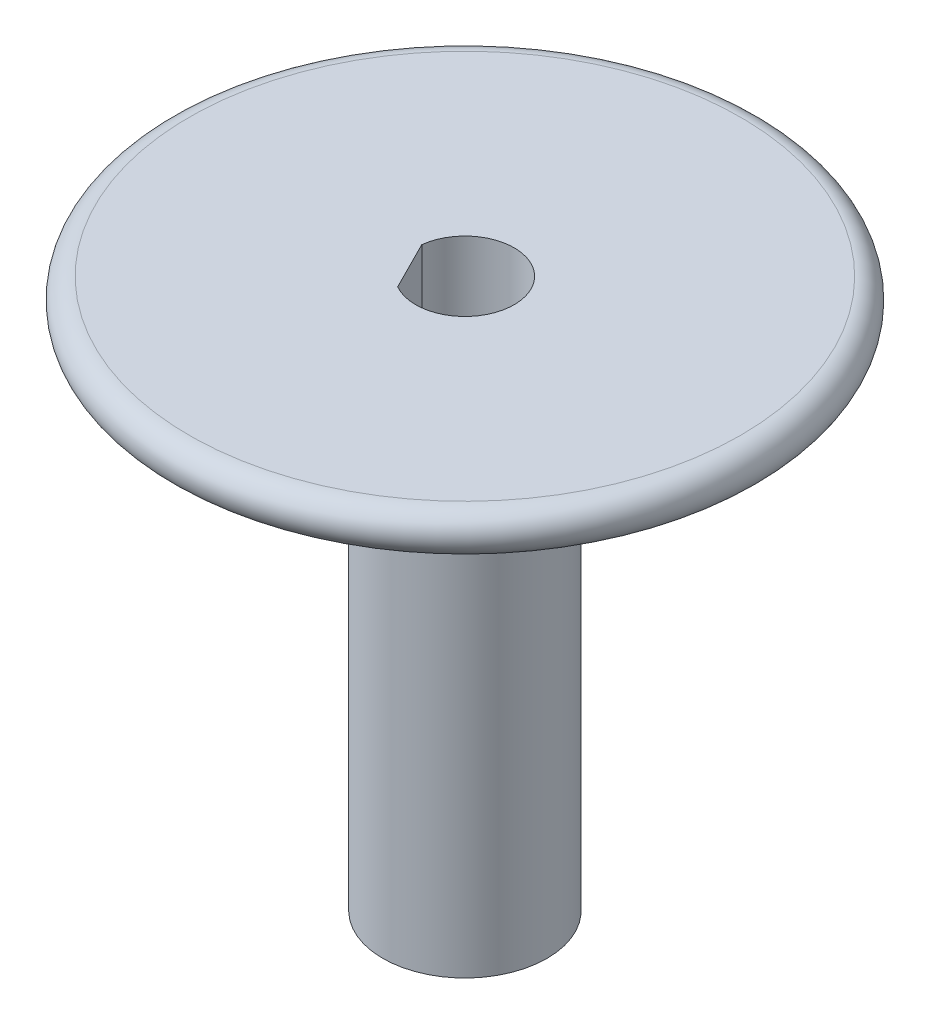
ISO-10303-21;
HEADER;
FILE_DESCRIPTION(('STEP AP214'),'2;1');
FILE_NAME('part.step','',(''),(''),'','','');
FILE_SCHEMA(('AUTOMOTIVE_DESIGN { 1 0 10303 214 1 1 1 1 }'));
ENDSEC;
DATA;
#1=APPLICATION_CONTEXT('core data for automotive mechanical design processes');
#2=APPLICATION_PROTOCOL_DEFINITION('international standard','automotive_design',2000,#1);
#3=PRODUCT_CONTEXT('',#1,'mechanical');
#4=PRODUCT('Part','Part','',(#3));
#5=PRODUCT_RELATED_PRODUCT_CATEGORY('part','',(#4));
#6=PRODUCT_DEFINITION_FORMATION('','',#4);
#7=PRODUCT_DEFINITION_CONTEXT('part definition',#1,'design');
#8=PRODUCT_DEFINITION('design','',#6,#7);
#9=PRODUCT_DEFINITION_SHAPE('','',#8);
#10=(LENGTH_UNIT() NAMED_UNIT(*) SI_UNIT(.MILLI.,.METRE.));
#11=(NAMED_UNIT(*) PLANE_ANGLE_UNIT() SI_UNIT($,.RADIAN.));
#12=(NAMED_UNIT(*) SI_UNIT($,.STERADIAN.) SOLID_ANGLE_UNIT());
#13=UNCERTAINTY_MEASURE_WITH_UNIT(LENGTH_MEASURE(1.E-05),#10,'distance_accuracy_value','');
#14=(GEOMETRIC_REPRESENTATION_CONTEXT(3) GLOBAL_UNCERTAINTY_ASSIGNED_CONTEXT((#13)) GLOBAL_UNIT_ASSIGNED_CONTEXT((#10,
#11,#12)) REPRESENTATION_CONTEXT('',''));
#15=CARTESIAN_POINT('',(0.,0.,0.));
#16=DIRECTION('',(0.,0.,1.));
#17=DIRECTION('',(1.,0.,0.));
#18=AXIS2_PLACEMENT_3D('',#15,#16,#17);
#19=CARTESIAN_POINT('',(0.,18.26337642131,0.));
#20=DIRECTION('',(0.,1.,0.));
#21=DIRECTION('',(-1.,0.,0.));
#22=AXIS2_PLACEMENT_3D('',#19,#20,#21);
#23=PLANE('',#22);
#24=CARTESIAN_POINT('',(0.,18.26337642131,0.));
#25=DIRECTION('',(0.,1.,0.));
#26=DIRECTION('',(-1.,0.,0.));
#27=AXIS2_PLACEMENT_3D('',#24,#25,#26);
#28=CIRCLE('',#27,3.04799060119711);
#29=CARTESIAN_POINT('',(-1.51176574735072,18.26337642131,2.6466603541299));
#30=VERTEX_POINT('',#29);
#31=CARTESIAN_POINT('',(-3.02683051241276,18.26337642131,-0.35852999053506));
#32=VERTEX_POINT('',#31);
#33=EDGE_CURVE('E47',#30,#32,#28,.T.);
#34=ORIENTED_EDGE('',*,*,#33,.F.);
#35=DIRECTION('',(0.450175238467399,0.,0.892940230178269));
#36=VECTOR('',#35,1.);
#37=CARTESIAN_POINT('',(-1.51176574735072,18.26337642131,2.6466603541299));
#38=LINE('',#37,#36);
#39=EDGE_CURVE('E67',#32,#30,#38,.T.);
#40=ORIENTED_EDGE('',*,*,#39,.F.);
#41=EDGE_LOOP('',(#34,#40));
#42=FACE_BOUND('',#41,.T.);
#43=CARTESIAN_POINT('',(0.,18.26337642131,0.));
#44=DIRECTION('',(0.,-1.,0.));
#45=DIRECTION('',(1.,0.,0.));
#46=AXIS2_PLACEMENT_3D('',#43,#44,#45);
#47=CIRCLE('',#46,17.0415037859707);
#48=CARTESIAN_POINT('',(17.0415037859707,18.26337642131,0.));
#49=VERTEX_POINT('',#48);
#50=EDGE_CURVE('E11',#49,#49,#47,.T.);
#51=ORIENTED_EDGE('',*,*,#50,.F.);
#52=EDGE_LOOP('',(#51));
#53=FACE_BOUND('',#52,.T.);
#54=ADVANCED_FACE('F33',(#42,#53),#23,.T.);
#55=CARTESIAN_POINT('',(0.,16.99337642131,0.));
#56=DIRECTION('',(0.,-1.,0.));
#57=DIRECTION('',(1.,0.,0.));
#58=AXIS2_PLACEMENT_3D('',#55,#56,#57);
#59=TOROIDAL_SURFACE('',#58,17.0415037859707,1.27);
#60=ORIENTED_EDGE('',*,*,#50,.T.);
#61=EDGE_LOOP('',(#60));
#62=FACE_BOUND('',#61,.T.);
#63=CARTESIAN_POINT('',(0.,15.72337642131,0.));
#64=DIRECTION('',(0.,-1.,0.));
#65=DIRECTION('',(1.,0.,0.));
#66=AXIS2_PLACEMENT_3D('',#63,#64,#65);
#67=CIRCLE('',#66,17.0415037859707);
#68=CARTESIAN_POINT('',(17.0415037859707,15.72337642131,0.));
#69=VERTEX_POINT('',#68);
#70=EDGE_CURVE('E40',#69,#69,#67,.T.);
#71=ORIENTED_EDGE('',*,*,#70,.F.);
#72=EDGE_LOOP('',(#71));
#73=FACE_BOUND('',#72,.T.);
#74=ADVANCED_FACE('F88',(#62,#73),#59,.T.);
#75=CARTESIAN_POINT('',(5.08,15.72337642131,0.));
#76=DIRECTION('',(0.,-1.,0.));
#77=DIRECTION('',(1.,0.,0.));
#78=AXIS2_PLACEMENT_3D('',#75,#76,#77);
#79=PLANE('',#78);
#80=ORIENTED_EDGE('',*,*,#70,.T.);
#81=EDGE_LOOP('',(#80));
#82=FACE_BOUND('',#81,.T.);
#83=CARTESIAN_POINT('',(0.,15.72337642131,0.));
#84=DIRECTION('',(0.,-1.,0.));
#85=DIRECTION('',(1.,0.,0.));
#86=AXIS2_PLACEMENT_3D('',#83,#84,#85);
#87=CIRCLE('',#86,5.08000000000001);
#88=CARTESIAN_POINT('',(5.08,15.72337642131,0.));
#89=VERTEX_POINT('',#88);
#90=EDGE_CURVE('E80',#89,#89,#87,.T.);
#91=ORIENTED_EDGE('',*,*,#90,.F.);
#92=EDGE_LOOP('',(#91));
#93=FACE_BOUND('',#92,.T.);
#94=ADVANCED_FACE('F85',(#82,#93),#79,.T.);
#95=CARTESIAN_POINT('',(0.,-15.72337642131,0.));
#96=DIRECTION('',(0.,-1.,0.));
#97=DIRECTION('',(1.,0.,0.));
#98=AXIS2_PLACEMENT_3D('',#95,#96,#97);
#99=CYLINDRICAL_SURFACE('',#98,5.08000000000001);
#100=ORIENTED_EDGE('',*,*,#90,.T.);
#101=EDGE_LOOP('',(#100));
#102=FACE_BOUND('',#101,.T.);
#103=CARTESIAN_POINT('',(0.,-15.72337642131,0.));
#104=DIRECTION('',(0.,-1.,0.));
#105=DIRECTION('',(1.,0.,0.));
#106=AXIS2_PLACEMENT_3D('',#103,#104,#105);
#107=CIRCLE('',#106,5.08);
#108=CARTESIAN_POINT('',(5.08,-15.72337642131,0.));
#109=VERTEX_POINT('',#108);
#110=EDGE_CURVE('E63',#109,#109,#107,.T.);
#111=ORIENTED_EDGE('',*,*,#110,.F.);
#112=EDGE_LOOP('',(#111));
#113=FACE_BOUND('',#112,.T.);
#114=ADVANCED_FACE('F95',(#102,#113),#99,.T.);
#115=CARTESIAN_POINT('',(5.08,-15.72337642131,0.));
#116=DIRECTION('',(0.,-1.,0.));
#117=DIRECTION('',(1.,0.,0.));
#118=AXIS2_PLACEMENT_3D('',#115,#116,#117);
#119=PLANE('',#118);
#120=CARTESIAN_POINT('',(0.,-15.72337642131,0.));
#121=DIRECTION('',(0.,1.,0.));
#122=DIRECTION('',(-1.,0.,0.));
#123=AXIS2_PLACEMENT_3D('',#120,#121,#122);
#124=CIRCLE('',#123,3.04799060119711);
#125=CARTESIAN_POINT('',(-1.51176574735072,-15.72337642131,2.6466603541299));
#126=VERTEX_POINT('',#125);
#127=CARTESIAN_POINT('',(-3.02683051241275,-15.72337642131,-0.358529990535059));
#128=VERTEX_POINT('',#127);
#129=EDGE_CURVE('E52',#126,#128,#124,.T.);
#130=ORIENTED_EDGE('',*,*,#129,.T.);
#131=DIRECTION('',(0.450175238467399,0.,0.892940230178269));
#132=VECTOR('',#131,1.);
#133=CARTESIAN_POINT('',(-1.51176574735072,-15.72337642131,2.6466603541299));
#134=LINE('',#133,#132);
#135=EDGE_CURVE('E74',#128,#126,#134,.T.);
#136=ORIENTED_EDGE('',*,*,#135,.T.);
#137=EDGE_LOOP('',(#130,#136));
#138=FACE_BOUND('',#137,.T.);
#139=ORIENTED_EDGE('',*,*,#110,.T.);
#140=EDGE_LOOP('',(#139));
#141=FACE_BOUND('',#140,.T.);
#142=ADVANCED_FACE('F100',(#138,#141),#119,.T.);
#143=CARTESIAN_POINT('',(0.,-15.72337642131,0.));
#144=DIRECTION('',(0.,1.,0.));
#145=DIRECTION('',(-1.,0.,0.));
#146=AXIS2_PLACEMENT_3D('',#143,#144,#145);
#147=CYLINDRICAL_SURFACE('',#146,3.04799060119711);
#148=ORIENTED_EDGE('',*,*,#33,.T.);
#149=DIRECTION('',(0.,1.,0.));
#150=VECTOR('',#149,1.);
#151=CARTESIAN_POINT('',(-3.02683051241275,-15.72337642131,-0.358529990535059));
#152=LINE('',#151,#150);
#153=EDGE_CURVE('E64',#128,#32,#152,.T.);
#154=ORIENTED_EDGE('',*,*,#153,.F.);
#155=ORIENTED_EDGE('',*,*,#129,.F.);
#156=DIRECTION('',(0.,1.,0.));
#157=VECTOR('',#156,1.);
#158=CARTESIAN_POINT('',(-1.51176574735072,-15.72337642131,2.6466603541299));
#159=LINE('',#158,#157);
#160=EDGE_CURVE('E57',#126,#30,#159,.T.);
#161=ORIENTED_EDGE('',*,*,#160,.T.);
#162=EDGE_LOOP('',(#148,#154,#155,#161));
#163=FACE_BOUND('',#162,.T.);
#164=ADVANCED_FACE('F59',(#163),#147,.F.);
#165=CARTESIAN_POINT('',(-1.51176574735072,-15.72337642131,2.6466603541299));
#166=DIRECTION('',(-0.892940230178269,0.,0.450175238467399));
#167=DIRECTION('',(0.450175238467399,0.,0.892940230178269));
#168=AXIS2_PLACEMENT_3D('',#165,#166,#167);
#169=PLANE('',#168);
#170=ORIENTED_EDGE('',*,*,#39,.T.);
#171=ORIENTED_EDGE('',*,*,#160,.F.);
#172=ORIENTED_EDGE('',*,*,#135,.F.);
#173=ORIENTED_EDGE('',*,*,#153,.T.);
#174=EDGE_LOOP('',(#170,#171,#172,#173));
#175=FACE_BOUND('',#174,.T.);
#176=ADVANCED_FACE('F68',(#175),#169,.F.);
#177=CLOSED_SHELL('',(#54,#74,#94,#114,#142,#164,#176));
#178=MANIFOLD_SOLID_BREP('B2',#177);
#179=ADVANCED_BREP_SHAPE_REPRESENTATION('',(#18,#178),#14);
#180=SHAPE_DEFINITION_REPRESENTATION(#9,#179);
ENDSEC;
END-ISO-10303-21;
